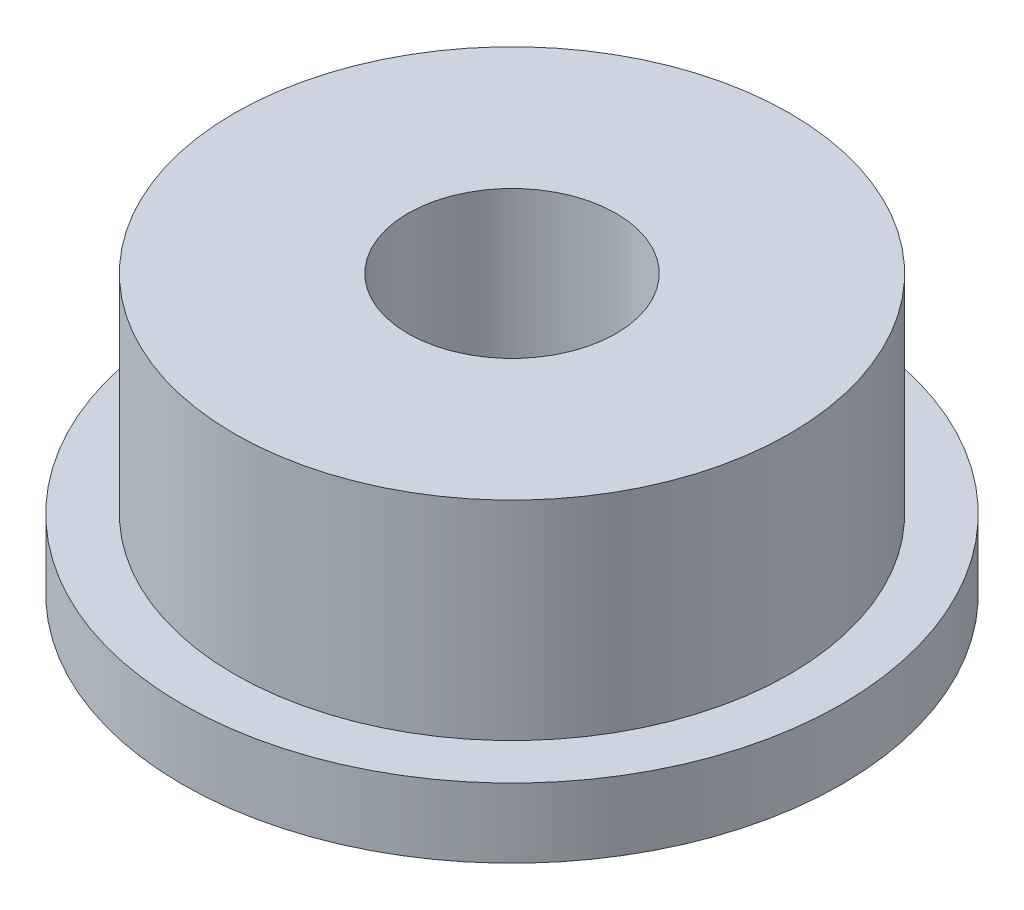
ISO-10303-21;
HEADER;
FILE_DESCRIPTION(('STEP AP214'),'2;1');
FILE_NAME('part.step','',(''),(''),'','','');
FILE_SCHEMA(('AUTOMOTIVE_DESIGN { 1 0 10303 214 1 1 1 1 }'));
ENDSEC;
DATA;
#1=APPLICATION_CONTEXT('core data for automotive mechanical design processes');
#2=APPLICATION_PROTOCOL_DEFINITION('international standard','automotive_design',2000,#1);
#3=PRODUCT_CONTEXT('',#1,'mechanical');
#4=PRODUCT('Part','Part','',(#3));
#5=PRODUCT_RELATED_PRODUCT_CATEGORY('part','',(#4));
#6=PRODUCT_DEFINITION_FORMATION('','',#4);
#7=PRODUCT_DEFINITION_CONTEXT('part definition',#1,'design');
#8=PRODUCT_DEFINITION('design','',#6,#7);
#9=PRODUCT_DEFINITION_SHAPE('','',#8);
#10=(LENGTH_UNIT() NAMED_UNIT(*) SI_UNIT(.MILLI.,.METRE.));
#11=(NAMED_UNIT(*) PLANE_ANGLE_UNIT() SI_UNIT($,.RADIAN.));
#12=(NAMED_UNIT(*) SI_UNIT($,.STERADIAN.) SOLID_ANGLE_UNIT());
#13=UNCERTAINTY_MEASURE_WITH_UNIT(LENGTH_MEASURE(1.E-05),#10,'distance_accuracy_value','');
#14=(GEOMETRIC_REPRESENTATION_CONTEXT(3) GLOBAL_UNCERTAINTY_ASSIGNED_CONTEXT((#13)) GLOBAL_UNIT_ASSIGNED_CONTEXT((#10,
#11,#12)) REPRESENTATION_CONTEXT('',''));
#15=CARTESIAN_POINT('',(0.,0.,0.));
#16=DIRECTION('',(0.,0.,1.));
#17=DIRECTION('',(1.,0.,0.));
#18=AXIS2_PLACEMENT_3D('',#15,#16,#17);
#19=CARTESIAN_POINT('',(0.,1.,0.));
#20=DIRECTION('',(0.,1.,0.));
#21=DIRECTION('',(0.,0.,1.));
#22=AXIS2_PLACEMENT_3D('',#19,#20,#21);
#23=PLANE('',#22);
#24=CARTESIAN_POINT('',(0.,1.,0.));
#25=DIRECTION('',(0.,1.,0.));
#26=DIRECTION('',(0.,0.,1.));
#27=AXIS2_PLACEMENT_3D('',#24,#25,#26);
#28=CIRCLE('',#27,4.);
#29=CARTESIAN_POINT('',(0.,1.,4.));
#30=VERTEX_POINT('',#29);
#31=EDGE_CURVE('E10',#30,#30,#28,.T.);
#32=ORIENTED_EDGE('',*,*,#31,.F.);
#33=EDGE_LOOP('',(#32));
#34=FACE_BOUND('',#33,.T.);
#35=CARTESIAN_POINT('',(0.,1.,0.));
#36=DIRECTION('',(0.,1.,0.));
#37=DIRECTION('',(0.,0.,1.));
#38=AXIS2_PLACEMENT_3D('',#35,#36,#37);
#39=CIRCLE('',#38,4.75);
#40=CARTESIAN_POINT('',(0.,1.,4.75));
#41=VERTEX_POINT('',#40);
#42=EDGE_CURVE('E40',#41,#41,#39,.T.);
#43=ORIENTED_EDGE('',*,*,#42,.T.);
#44=EDGE_LOOP('',(#43));
#45=FACE_BOUND('',#44,.T.);
#46=ADVANCED_FACE('F32',(#34,#45),#23,.T.);
#47=CARTESIAN_POINT('',(0.,0.,0.));
#48=DIRECTION('',(0.,1.,0.));
#49=DIRECTION('',(0.,0.,1.));
#50=AXIS2_PLACEMENT_3D('',#47,#48,#49);
#51=PLANE('',#50);
#52=CARTESIAN_POINT('',(0.,0.,0.));
#53=DIRECTION('',(0.,1.,0.));
#54=DIRECTION('',(0.,0.,1.));
#55=AXIS2_PLACEMENT_3D('',#52,#53,#54);
#56=CIRCLE('',#55,4.75);
#57=CARTESIAN_POINT('',(0.,0.,4.75));
#58=VERTEX_POINT('',#57);
#59=EDGE_CURVE('E36',#58,#58,#56,.T.);
#60=ORIENTED_EDGE('',*,*,#59,.F.);
#61=EDGE_LOOP('',(#60));
#62=FACE_BOUND('',#61,.T.);
#63=CARTESIAN_POINT('',(0.,0.,0.));
#64=DIRECTION('',(0.,1.,0.));
#65=DIRECTION('',(0.,0.,1.));
#66=AXIS2_PLACEMENT_3D('',#63,#64,#65);
#67=CIRCLE('',#66,1.5);
#68=CARTESIAN_POINT('',(0.,0.,1.5));
#69=VERTEX_POINT('',#68);
#70=EDGE_CURVE('E49',#69,#69,#67,.T.);
#71=ORIENTED_EDGE('',*,*,#70,.T.);
#72=EDGE_LOOP('',(#71));
#73=FACE_BOUND('',#72,.T.);
#74=ADVANCED_FACE('F76',(#62,#73),#51,.F.);
#75=CARTESIAN_POINT('',(0.,1.,0.));
#76=DIRECTION('',(0.,-1.,0.));
#77=DIRECTION('',(0.,0.,-1.));
#78=AXIS2_PLACEMENT_3D('',#75,#76,#77);
#79=CYLINDRICAL_SURFACE('',#78,4.75);
#80=ORIENTED_EDGE('',*,*,#42,.F.);
#81=EDGE_LOOP('',(#80));
#82=FACE_BOUND('',#81,.T.);
#83=ORIENTED_EDGE('',*,*,#59,.T.);
#84=EDGE_LOOP('',(#83));
#85=FACE_BOUND('',#84,.T.);
#86=ADVANCED_FACE('F34',(#82,#85),#79,.T.);
#87=CARTESIAN_POINT('',(0.,1.,0.));
#88=DIRECTION('',(0.,-1.,0.));
#89=DIRECTION('',(0.,0.,-1.));
#90=AXIS2_PLACEMENT_3D('',#87,#88,#89);
#91=CYLINDRICAL_SURFACE('',#90,1.5);
#92=ORIENTED_EDGE('',*,*,#70,.F.);
#93=EDGE_LOOP('',(#92));
#94=FACE_BOUND('',#93,.T.);
#95=CARTESIAN_POINT('',(0.,4.,0.));
#96=DIRECTION('',(0.,1.,0.));
#97=DIRECTION('',(0.,0.,1.));
#98=AXIS2_PLACEMENT_3D('',#95,#96,#97);
#99=CIRCLE('',#98,1.5);
#100=CARTESIAN_POINT('',(0.,4.,1.5));
#101=VERTEX_POINT('',#100);
#102=EDGE_CURVE('E55',#101,#101,#99,.T.);
#103=ORIENTED_EDGE('',*,*,#102,.T.);
#104=EDGE_LOOP('',(#103));
#105=FACE_BOUND('',#104,.T.);
#106=ADVANCED_FACE('F61',(#94,#105),#91,.F.);
#107=CARTESIAN_POINT('',(0.,4.,0.));
#108=DIRECTION('',(0.,1.,0.));
#109=DIRECTION('',(0.,0.,1.));
#110=AXIS2_PLACEMENT_3D('',#107,#108,#109);
#111=PLANE('',#110);
#112=CARTESIAN_POINT('',(0.,4.,0.));
#113=DIRECTION('',(0.,1.,0.));
#114=DIRECTION('',(0.,0.,1.));
#115=AXIS2_PLACEMENT_3D('',#112,#113,#114);
#116=CIRCLE('',#115,4.);
#117=CARTESIAN_POINT('',(0.,4.,4.));
#118=VERTEX_POINT('',#117);
#119=EDGE_CURVE('E47',#118,#118,#116,.T.);
#120=ORIENTED_EDGE('',*,*,#119,.T.);
#121=EDGE_LOOP('',(#120));
#122=FACE_BOUND('',#121,.T.);
#123=ORIENTED_EDGE('',*,*,#102,.F.);
#124=EDGE_LOOP('',(#123));
#125=FACE_BOUND('',#124,.T.);
#126=ADVANCED_FACE('F63',(#122,#125),#111,.T.);
#127=CARTESIAN_POINT('',(0.,4.,0.));
#128=DIRECTION('',(0.,-1.,0.));
#129=DIRECTION('',(0.,0.,-1.));
#130=AXIS2_PLACEMENT_3D('',#127,#128,#129);
#131=CYLINDRICAL_SURFACE('',#130,4.);
#132=ORIENTED_EDGE('',*,*,#119,.F.);
#133=EDGE_LOOP('',(#132));
#134=FACE_BOUND('',#133,.T.);
#135=ORIENTED_EDGE('',*,*,#31,.T.);
#136=EDGE_LOOP('',(#135));
#137=FACE_BOUND('',#136,.T.);
#138=ADVANCED_FACE('F65',(#134,#137),#131,.T.);
#139=CLOSED_SHELL('',(#46,#74,#86,#106,#126,#138));
#140=MANIFOLD_SOLID_BREP('B2',#139);
#141=ADVANCED_BREP_SHAPE_REPRESENTATION('',(#18,#140),#14);
#142=SHAPE_DEFINITION_REPRESENTATION(#9,#141);
ENDSEC;
END-ISO-10303-21;
